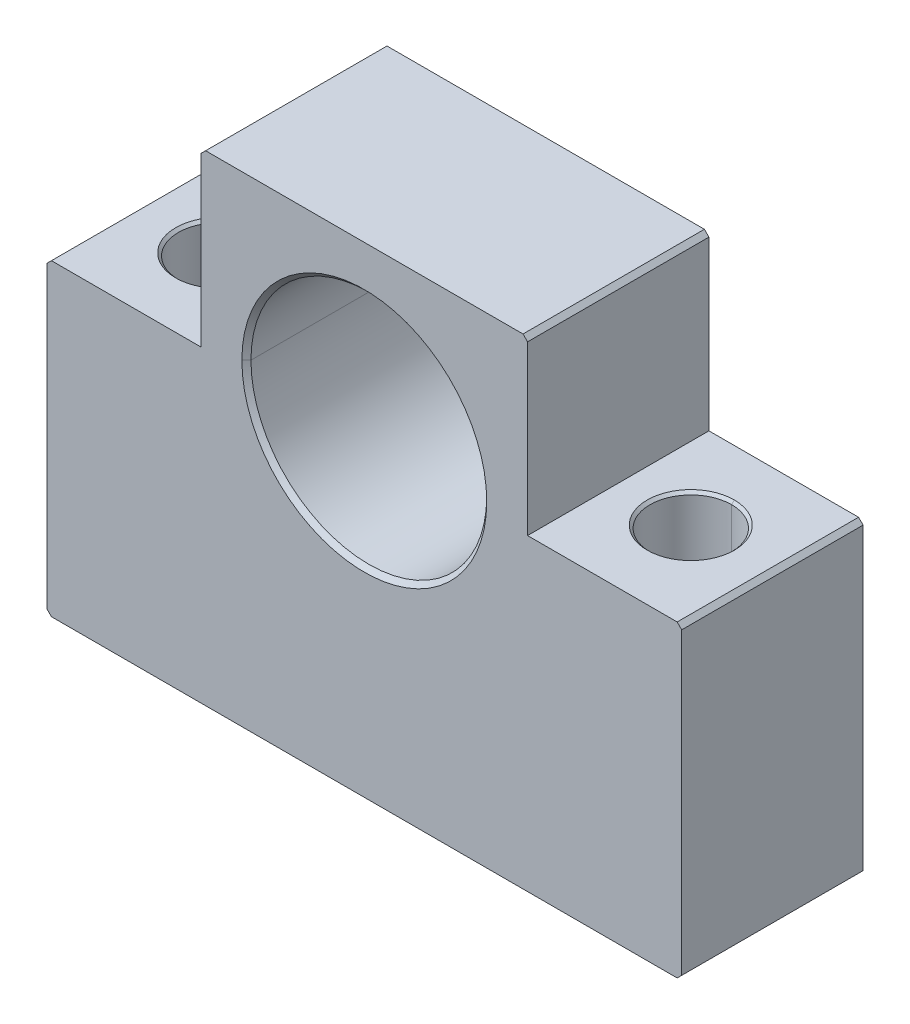
ISO-10303-21;
HEADER;
FILE_DESCRIPTION(('STEP AP214'),'2;1');
FILE_NAME('part.step','',(''),(''),'','','');
FILE_SCHEMA(('AUTOMOTIVE_DESIGN { 1 0 10303 214 1 1 1 1 }'));
ENDSEC;
DATA;
#1=APPLICATION_CONTEXT('core data for automotive mechanical design processes');
#2=APPLICATION_PROTOCOL_DEFINITION('international standard','automotive_design',2000,#1);
#3=PRODUCT_CONTEXT('',#1,'mechanical');
#4=PRODUCT('Part','Part','',(#3));
#5=PRODUCT_RELATED_PRODUCT_CATEGORY('part','',(#4));
#6=PRODUCT_DEFINITION_FORMATION('','',#4);
#7=PRODUCT_DEFINITION_CONTEXT('part definition',#1,'design');
#8=PRODUCT_DEFINITION('design','',#6,#7);
#9=PRODUCT_DEFINITION_SHAPE('','',#8);
#10=(LENGTH_UNIT() NAMED_UNIT(*) SI_UNIT(.MILLI.,.METRE.));
#11=(NAMED_UNIT(*) PLANE_ANGLE_UNIT() SI_UNIT($,.RADIAN.));
#12=(NAMED_UNIT(*) SI_UNIT($,.STERADIAN.) SOLID_ANGLE_UNIT());
#13=UNCERTAINTY_MEASURE_WITH_UNIT(LENGTH_MEASURE(1.E-05),#10,'distance_accuracy_value','');
#14=(GEOMETRIC_REPRESENTATION_CONTEXT(3) GLOBAL_UNCERTAINTY_ASSIGNED_CONTEXT((#13)) GLOBAL_UNIT_ASSIGNED_CONTEXT((#10,
#11,#12)) REPRESENTATION_CONTEXT('',''));
#15=CARTESIAN_POINT('',(0.,0.,0.));
#16=DIRECTION('',(0.,0.,1.));
#17=DIRECTION('',(1.,0.,0.));
#18=AXIS2_PLACEMENT_3D('',#15,#16,#17);
#19=CARTESIAN_POINT('',(-34.5,34.,10.));
#20=DIRECTION('',(0.707106781186548,-0.707106781186548,0.));
#21=DIRECTION('',(0.707106781186548,0.707106781186548,0.));
#22=AXIS2_PLACEMENT_3D('',#19,#20,#21);
#23=PLANE('',#22);
#24=DIRECTION('',(-0.707106781186548,-0.707106781186548,0.));
#25=VECTOR('',#24,1.);
#26=CARTESIAN_POINT('',(-34.5,34.,-10.));
#27=LINE('',#26,#25);
#28=CARTESIAN_POINT('',(-34.5,34.,-10.));
#29=VERTEX_POINT('',#28);
#30=CARTESIAN_POINT('',(-35.,33.5,-10.));
#31=VERTEX_POINT('',#30);
#32=EDGE_CURVE('E11',#29,#31,#27,.T.);
#33=ORIENTED_EDGE('',*,*,#32,.T.);
#34=DIRECTION('',(0.,0.,-1.));
#35=VECTOR('',#34,1.);
#36=CARTESIAN_POINT('',(-35.,33.5,10.));
#37=LINE('',#36,#35);
#38=CARTESIAN_POINT('',(-35.,33.5,10.));
#39=VERTEX_POINT('',#38);
#40=EDGE_CURVE('E25',#39,#31,#37,.T.);
#41=ORIENTED_EDGE('',*,*,#40,.F.);
#42=DIRECTION('',(-0.707106781186548,-0.707106781186548,0.));
#43=VECTOR('',#42,1.);
#44=CARTESIAN_POINT('',(-34.5,34.,10.));
#45=LINE('',#44,#43);
#46=CARTESIAN_POINT('',(-34.5,34.,10.));
#47=VERTEX_POINT('',#46);
#48=EDGE_CURVE('E518',#47,#39,#45,.T.);
#49=ORIENTED_EDGE('',*,*,#48,.F.);
#50=DIRECTION('',(0.,0.,-1.));
#51=VECTOR('',#50,1.);
#52=CARTESIAN_POINT('',(-34.5,34.,10.));
#53=LINE('',#52,#51);
#54=EDGE_CURVE('E514',#47,#29,#53,.T.);
#55=ORIENTED_EDGE('',*,*,#54,.T.);
#56=EDGE_LOOP('',(#33,#41,#49,#55));
#57=FACE_BOUND('',#56,.T.);
#58=ADVANCED_FACE('F17',(#57),#23,.F.);
#59=CARTESIAN_POINT('',(-18.,34.,10.));
#60=DIRECTION('',(0.,-1.,0.));
#61=DIRECTION('',(0.,0.,-1.));
#62=AXIS2_PLACEMENT_3D('',#59,#60,#61);
#63=PLANE('',#62);
#64=CARTESIAN_POINT('',(-26.,34.,0.));
#65=DIRECTION('',(0.,1.,0.));
#66=DIRECTION('',(0.,0.,1.));
#67=AXIS2_PLACEMENT_3D('',#64,#65,#66);
#68=CIRCLE('',#67,4.8);
#69=CARTESIAN_POINT('',(-26.,34.,-4.8));
#70=VERTEX_POINT('',#69);
#71=CARTESIAN_POINT('',(-26.,34.,4.8));
#72=VERTEX_POINT('',#71);
#73=EDGE_CURVE('E509',#70,#72,#68,.T.);
#74=ORIENTED_EDGE('',*,*,#73,.F.);
#75=CARTESIAN_POINT('',(-26.,34.,0.));
#76=DIRECTION('',(0.,1.,0.));
#77=DIRECTION('',(0.,0.,1.));
#78=AXIS2_PLACEMENT_3D('',#75,#76,#77);
#79=CIRCLE('',#78,4.8);
#80=EDGE_CURVE('E504',#72,#70,#79,.T.);
#81=ORIENTED_EDGE('',*,*,#80,.F.);
#82=EDGE_LOOP('',(#74,#81));
#83=FACE_BOUND('',#82,.T.);
#84=DIRECTION('',(-1.,0.,0.));
#85=VECTOR('',#84,1.);
#86=CARTESIAN_POINT('',(-18.,34.,-10.));
#87=LINE('',#86,#85);
#88=CARTESIAN_POINT('',(-18.,34.,-10.));
#89=VERTEX_POINT('',#88);
#90=EDGE_CURVE('E499',#89,#29,#87,.T.);
#91=ORIENTED_EDGE('',*,*,#90,.T.);
#92=ORIENTED_EDGE('',*,*,#54,.F.);
#93=DIRECTION('',(-1.,0.,0.));
#94=VECTOR('',#93,1.);
#95=CARTESIAN_POINT('',(-18.,34.,10.));
#96=LINE('',#95,#94);
#97=CARTESIAN_POINT('',(-18.,34.,10.));
#98=VERTEX_POINT('',#97);
#99=EDGE_CURVE('E494',#98,#47,#96,.T.);
#100=ORIENTED_EDGE('',*,*,#99,.F.);
#101=DIRECTION('',(0.,0.,-1.));
#102=VECTOR('',#101,1.);
#103=CARTESIAN_POINT('',(-18.,34.,10.));
#104=LINE('',#103,#102);
#105=EDGE_CURVE('E490',#98,#89,#104,.T.);
#106=ORIENTED_EDGE('',*,*,#105,.T.);
#107=EDGE_LOOP('',(#91,#92,#100,#106));
#108=FACE_BOUND('',#107,.T.);
#109=ADVANCED_FACE('F536',(#83,#108),#63,.F.);
#110=CARTESIAN_POINT('',(-18.,52.5,10.));
#111=DIRECTION('',(1.,0.,0.));
#112=DIRECTION('',(0.,0.,-1.));
#113=AXIS2_PLACEMENT_3D('',#110,#111,#112);
#114=PLANE('',#113);
#115=DIRECTION('',(0.,-1.,0.));
#116=VECTOR('',#115,1.);
#117=CARTESIAN_POINT('',(-18.,52.5,-10.));
#118=LINE('',#117,#116);
#119=CARTESIAN_POINT('',(-18.,52.5,-10.));
#120=VERTEX_POINT('',#119);
#121=EDGE_CURVE('E485',#120,#89,#118,.T.);
#122=ORIENTED_EDGE('',*,*,#121,.T.);
#123=ORIENTED_EDGE('',*,*,#105,.F.);
#124=DIRECTION('',(0.,-1.,0.));
#125=VECTOR('',#124,1.);
#126=CARTESIAN_POINT('',(-18.,52.5,10.));
#127=LINE('',#126,#125);
#128=CARTESIAN_POINT('',(-18.,52.5,10.));
#129=VERTEX_POINT('',#128);
#130=EDGE_CURVE('E480',#129,#98,#127,.T.);
#131=ORIENTED_EDGE('',*,*,#130,.F.);
#132=DIRECTION('',(0.,0.,-1.));
#133=VECTOR('',#132,1.);
#134=CARTESIAN_POINT('',(-18.,52.5,10.));
#135=LINE('',#134,#133);
#136=EDGE_CURVE('E476',#129,#120,#135,.T.);
#137=ORIENTED_EDGE('',*,*,#136,.T.);
#138=EDGE_LOOP('',(#122,#123,#131,#137));
#139=FACE_BOUND('',#138,.T.);
#140=ADVANCED_FACE('F581',(#139),#114,.F.);
#141=CARTESIAN_POINT('',(-17.5,53.,10.));
#142=DIRECTION('',(0.707106781186548,-0.707106781186548,0.));
#143=DIRECTION('',(0.707106781186548,0.707106781186548,0.));
#144=AXIS2_PLACEMENT_3D('',#141,#142,#143);
#145=PLANE('',#144);
#146=DIRECTION('',(-0.707106781186548,-0.707106781186548,0.));
#147=VECTOR('',#146,1.);
#148=CARTESIAN_POINT('',(-17.5,53.,-10.));
#149=LINE('',#148,#147);
#150=CARTESIAN_POINT('',(-17.5,53.,-10.));
#151=VERTEX_POINT('',#150);
#152=EDGE_CURVE('E471',#151,#120,#149,.T.);
#153=ORIENTED_EDGE('',*,*,#152,.T.);
#154=ORIENTED_EDGE('',*,*,#136,.F.);
#155=DIRECTION('',(-0.707106781186548,-0.707106781186548,0.));
#156=VECTOR('',#155,1.);
#157=CARTESIAN_POINT('',(-17.5,53.,10.));
#158=LINE('',#157,#156);
#159=CARTESIAN_POINT('',(-17.5,53.,10.));
#160=VERTEX_POINT('',#159);
#161=EDGE_CURVE('E466',#160,#129,#158,.T.);
#162=ORIENTED_EDGE('',*,*,#161,.F.);
#163=DIRECTION('',(0.,0.,-1.));
#164=VECTOR('',#163,1.);
#165=CARTESIAN_POINT('',(-17.5,53.,10.));
#166=LINE('',#165,#164);
#167=EDGE_CURVE('E462',#160,#151,#166,.T.);
#168=ORIENTED_EDGE('',*,*,#167,.T.);
#169=EDGE_LOOP('',(#153,#154,#162,#168));
#170=FACE_BOUND('',#169,.T.);
#171=ADVANCED_FACE('F578',(#170),#145,.F.);
#172=CARTESIAN_POINT('',(17.5,53.,10.));
#173=DIRECTION('',(0.,-1.,0.));
#174=DIRECTION('',(0.,0.,-1.));
#175=AXIS2_PLACEMENT_3D('',#172,#173,#174);
#176=PLANE('',#175);
#177=DIRECTION('',(-1.,0.,0.));
#178=VECTOR('',#177,1.);
#179=CARTESIAN_POINT('',(17.5,53.,-10.));
#180=LINE('',#179,#178);
#181=CARTESIAN_POINT('',(17.5,53.,-10.));
#182=VERTEX_POINT('',#181);
#183=EDGE_CURVE('E457',#182,#151,#180,.T.);
#184=ORIENTED_EDGE('',*,*,#183,.T.);
#185=ORIENTED_EDGE('',*,*,#167,.F.);
#186=DIRECTION('',(-1.,0.,0.));
#187=VECTOR('',#186,1.);
#188=CARTESIAN_POINT('',(17.5,53.,10.));
#189=LINE('',#188,#187);
#190=CARTESIAN_POINT('',(17.5,53.,10.));
#191=VERTEX_POINT('',#190);
#192=EDGE_CURVE('E452',#191,#160,#189,.T.);
#193=ORIENTED_EDGE('',*,*,#192,.F.);
#194=DIRECTION('',(0.,0.,-1.));
#195=VECTOR('',#194,1.);
#196=CARTESIAN_POINT('',(17.5,53.,10.));
#197=LINE('',#196,#195);
#198=EDGE_CURVE('E448',#191,#182,#197,.T.);
#199=ORIENTED_EDGE('',*,*,#198,.T.);
#200=EDGE_LOOP('',(#184,#185,#193,#199));
#201=FACE_BOUND('',#200,.T.);
#202=ADVANCED_FACE('F575',(#201),#176,.F.);
#203=CARTESIAN_POINT('',(18.,52.5,10.));
#204=DIRECTION('',(-0.707106781186548,-0.707106781186548,0.));
#205=DIRECTION('',(0.707106781186548,-0.707106781186548,0.));
#206=AXIS2_PLACEMENT_3D('',#203,#204,#205);
#207=PLANE('',#206);
#208=DIRECTION('',(-0.707106781186548,0.707106781186548,0.));
#209=VECTOR('',#208,1.);
#210=CARTESIAN_POINT('',(18.,52.5,-10.));
#211=LINE('',#210,#209);
#212=CARTESIAN_POINT('',(18.,52.5,-10.));
#213=VERTEX_POINT('',#212);
#214=EDGE_CURVE('E443',#213,#182,#211,.T.);
#215=ORIENTED_EDGE('',*,*,#214,.T.);
#216=ORIENTED_EDGE('',*,*,#198,.F.);
#217=DIRECTION('',(-0.707106781186548,0.707106781186548,0.));
#218=VECTOR('',#217,1.);
#219=CARTESIAN_POINT('',(18.,52.5,10.));
#220=LINE('',#219,#218);
#221=CARTESIAN_POINT('',(18.,52.5,10.));
#222=VERTEX_POINT('',#221);
#223=EDGE_CURVE('E438',#222,#191,#220,.T.);
#224=ORIENTED_EDGE('',*,*,#223,.F.);
#225=DIRECTION('',(0.,0.,-1.));
#226=VECTOR('',#225,1.);
#227=CARTESIAN_POINT('',(18.,52.5,10.));
#228=LINE('',#227,#226);
#229=EDGE_CURVE('E434',#222,#213,#228,.T.);
#230=ORIENTED_EDGE('',*,*,#229,.T.);
#231=EDGE_LOOP('',(#215,#216,#224,#230));
#232=FACE_BOUND('',#231,.T.);
#233=ADVANCED_FACE('F572',(#232),#207,.F.);
#234=CARTESIAN_POINT('',(18.,34.,10.));
#235=DIRECTION('',(-1.,0.,0.));
#236=DIRECTION('',(0.,0.,1.));
#237=AXIS2_PLACEMENT_3D('',#234,#235,#236);
#238=PLANE('',#237);
#239=DIRECTION('',(0.,1.,0.));
#240=VECTOR('',#239,1.);
#241=CARTESIAN_POINT('',(18.,34.,-10.));
#242=LINE('',#241,#240);
#243=CARTESIAN_POINT('',(18.,34.,-10.));
#244=VERTEX_POINT('',#243);
#245=EDGE_CURVE('E429',#244,#213,#242,.T.);
#246=ORIENTED_EDGE('',*,*,#245,.T.);
#247=ORIENTED_EDGE('',*,*,#229,.F.);
#248=DIRECTION('',(0.,1.,0.));
#249=VECTOR('',#248,1.);
#250=CARTESIAN_POINT('',(18.,34.,10.));
#251=LINE('',#250,#249);
#252=CARTESIAN_POINT('',(18.,34.,10.));
#253=VERTEX_POINT('',#252);
#254=EDGE_CURVE('E424',#253,#222,#251,.T.);
#255=ORIENTED_EDGE('',*,*,#254,.F.);
#256=DIRECTION('',(0.,0.,-1.));
#257=VECTOR('',#256,1.);
#258=CARTESIAN_POINT('',(18.,34.,10.));
#259=LINE('',#258,#257);
#260=EDGE_CURVE('E420',#253,#244,#259,.T.);
#261=ORIENTED_EDGE('',*,*,#260,.T.);
#262=EDGE_LOOP('',(#246,#247,#255,#261));
#263=FACE_BOUND('',#262,.T.);
#264=ADVANCED_FACE('F566',(#263),#238,.F.);
#265=CARTESIAN_POINT('',(34.5,34.,10.));
#266=DIRECTION('',(0.,-1.,0.));
#267=DIRECTION('',(0.,0.,-1.));
#268=AXIS2_PLACEMENT_3D('',#265,#266,#267);
#269=PLANE('',#268);
#270=CARTESIAN_POINT('',(26.,34.,0.));
#271=DIRECTION('',(0.,1.,0.));
#272=DIRECTION('',(0.,0.,1.));
#273=AXIS2_PLACEMENT_3D('',#270,#271,#272);
#274=CIRCLE('',#273,4.8);
#275=CARTESIAN_POINT('',(26.,34.,-4.8));
#276=VERTEX_POINT('',#275);
#277=CARTESIAN_POINT('',(26.,34.,4.8));
#278=VERTEX_POINT('',#277);
#279=EDGE_CURVE('E191',#276,#278,#274,.T.);
#280=ORIENTED_EDGE('',*,*,#279,.F.);
#281=CARTESIAN_POINT('',(26.,34.,0.));
#282=DIRECTION('',(0.,1.,0.));
#283=DIRECTION('',(0.,0.,1.));
#284=AXIS2_PLACEMENT_3D('',#281,#282,#283);
#285=CIRCLE('',#284,4.8);
#286=EDGE_CURVE('E413',#278,#276,#285,.T.);
#287=ORIENTED_EDGE('',*,*,#286,.F.);
#288=EDGE_LOOP('',(#280,#287));
#289=FACE_BOUND('',#288,.T.);
#290=DIRECTION('',(-1.,0.,0.));
#291=VECTOR('',#290,1.);
#292=CARTESIAN_POINT('',(34.5,34.,-10.));
#293=LINE('',#292,#291);
#294=CARTESIAN_POINT('',(34.5,34.,-10.));
#295=VERTEX_POINT('',#294);
#296=EDGE_CURVE('E408',#295,#244,#293,.T.);
#297=ORIENTED_EDGE('',*,*,#296,.T.);
#298=ORIENTED_EDGE('',*,*,#260,.F.);
#299=DIRECTION('',(-1.,0.,0.));
#300=VECTOR('',#299,1.);
#301=CARTESIAN_POINT('',(34.5,34.,10.));
#302=LINE('',#301,#300);
#303=CARTESIAN_POINT('',(34.5,34.,10.));
#304=VERTEX_POINT('',#303);
#305=EDGE_CURVE('E403',#304,#253,#302,.T.);
#306=ORIENTED_EDGE('',*,*,#305,.F.);
#307=DIRECTION('',(0.,0.,-1.));
#308=VECTOR('',#307,1.);
#309=CARTESIAN_POINT('',(34.5,34.,10.));
#310=LINE('',#309,#308);
#311=EDGE_CURVE('E399',#304,#295,#310,.T.);
#312=ORIENTED_EDGE('',*,*,#311,.T.);
#313=EDGE_LOOP('',(#297,#298,#306,#312));
#314=FACE_BOUND('',#313,.T.);
#315=ADVANCED_FACE('F562',(#289,#314),#269,.F.);
#316=CARTESIAN_POINT('',(35.,33.5,10.));
#317=DIRECTION('',(-0.707106781186548,-0.707106781186548,0.));
#318=DIRECTION('',(0.707106781186548,-0.707106781186548,0.));
#319=AXIS2_PLACEMENT_3D('',#316,#317,#318);
#320=PLANE('',#319);
#321=DIRECTION('',(-0.707106781186548,0.707106781186548,0.));
#322=VECTOR('',#321,1.);
#323=CARTESIAN_POINT('',(35.,33.5,-10.));
#324=LINE('',#323,#322);
#325=CARTESIAN_POINT('',(35.,33.5,-10.));
#326=VERTEX_POINT('',#325);
#327=EDGE_CURVE('E394',#326,#295,#324,.T.);
#328=ORIENTED_EDGE('',*,*,#327,.T.);
#329=ORIENTED_EDGE('',*,*,#311,.F.);
#330=DIRECTION('',(-0.707106781186548,0.707106781186548,0.));
#331=VECTOR('',#330,1.);
#332=CARTESIAN_POINT('',(35.,33.5,10.));
#333=LINE('',#332,#331);
#334=CARTESIAN_POINT('',(35.,33.5,10.));
#335=VERTEX_POINT('',#334);
#336=EDGE_CURVE('E389',#335,#304,#333,.T.);
#337=ORIENTED_EDGE('',*,*,#336,.F.);
#338=DIRECTION('',(0.,0.,-1.));
#339=VECTOR('',#338,1.);
#340=CARTESIAN_POINT('',(35.,33.5,10.));
#341=LINE('',#340,#339);
#342=EDGE_CURVE('E385',#335,#326,#341,.T.);
#343=ORIENTED_EDGE('',*,*,#342,.T.);
#344=EDGE_LOOP('',(#328,#329,#337,#343));
#345=FACE_BOUND('',#344,.T.);
#346=ADVANCED_FACE('F559',(#345),#320,.F.);
#347=CARTESIAN_POINT('',(35.,0.5,10.));
#348=DIRECTION('',(-1.,0.,0.));
#349=DIRECTION('',(0.,0.,1.));
#350=AXIS2_PLACEMENT_3D('',#347,#348,#349);
#351=PLANE('',#350);
#352=DIRECTION('',(0.,1.,0.));
#353=VECTOR('',#352,1.);
#354=CARTESIAN_POINT('',(35.,0.5,-10.));
#355=LINE('',#354,#353);
#356=CARTESIAN_POINT('',(35.,0.5,-10.));
#357=VERTEX_POINT('',#356);
#358=EDGE_CURVE('E380',#357,#326,#355,.T.);
#359=ORIENTED_EDGE('',*,*,#358,.T.);
#360=ORIENTED_EDGE('',*,*,#342,.F.);
#361=DIRECTION('',(0.,1.,0.));
#362=VECTOR('',#361,1.);
#363=CARTESIAN_POINT('',(35.,0.5,10.));
#364=LINE('',#363,#362);
#365=CARTESIAN_POINT('',(35.,0.5,10.));
#366=VERTEX_POINT('',#365);
#367=EDGE_CURVE('E375',#366,#335,#364,.T.);
#368=ORIENTED_EDGE('',*,*,#367,.F.);
#369=DIRECTION('',(0.,0.,-1.));
#370=VECTOR('',#369,1.);
#371=CARTESIAN_POINT('',(35.,0.5,10.));
#372=LINE('',#371,#370);
#373=EDGE_CURVE('E371',#366,#357,#372,.T.);
#374=ORIENTED_EDGE('',*,*,#373,.T.);
#375=EDGE_LOOP('',(#359,#360,#368,#374));
#376=FACE_BOUND('',#375,.T.);
#377=ADVANCED_FACE('F554',(#376),#351,.F.);
#378=CARTESIAN_POINT('',(34.5,0.,10.));
#379=DIRECTION('',(-0.707106781186547,0.707106781186548,0.));
#380=DIRECTION('',(-0.707106781186548,-0.707106781186547,0.));
#381=AXIS2_PLACEMENT_3D('',#378,#379,#380);
#382=PLANE('',#381);
#383=DIRECTION('',(0.707106781186548,0.707106781186547,0.));
#384=VECTOR('',#383,1.);
#385=CARTESIAN_POINT('',(34.5,0.,-10.));
#386=LINE('',#385,#384);
#387=CARTESIAN_POINT('',(34.5,0.,-10.));
#388=VERTEX_POINT('',#387);
#389=EDGE_CURVE('E366',#388,#357,#386,.T.);
#390=ORIENTED_EDGE('',*,*,#389,.T.);
#391=ORIENTED_EDGE('',*,*,#373,.F.);
#392=DIRECTION('',(0.707106781186548,0.707106781186547,0.));
#393=VECTOR('',#392,1.);
#394=CARTESIAN_POINT('',(34.5,0.,10.));
#395=LINE('',#394,#393);
#396=CARTESIAN_POINT('',(34.5,0.,10.));
#397=VERTEX_POINT('',#396);
#398=EDGE_CURVE('E361',#397,#366,#395,.T.);
#399=ORIENTED_EDGE('',*,*,#398,.F.);
#400=DIRECTION('',(0.,0.,-1.));
#401=VECTOR('',#400,1.);
#402=CARTESIAN_POINT('',(34.5,0.,10.));
#403=LINE('',#402,#401);
#404=EDGE_CURVE('E357',#397,#388,#403,.T.);
#405=ORIENTED_EDGE('',*,*,#404,.T.);
#406=EDGE_LOOP('',(#390,#391,#399,#405));
#407=FACE_BOUND('',#406,.T.);
#408=ADVANCED_FACE('F551',(#407),#382,.F.);
#409=CARTESIAN_POINT('',(-34.5,0.,10.));
#410=DIRECTION('',(0.,1.,0.));
#411=DIRECTION('',(0.,0.,1.));
#412=AXIS2_PLACEMENT_3D('',#409,#410,#411);
#413=PLANE('',#412);
#414=CARTESIAN_POINT('',(26.,0.,0.));
#415=DIRECTION('',(0.,1.,0.));
#416=DIRECTION('',(0.,0.,1.));
#417=AXIS2_PLACEMENT_3D('',#414,#415,#416);
#418=CIRCLE('',#417,4.5);
#419=CARTESIAN_POINT('',(26.,0.,4.5));
#420=VERTEX_POINT('',#419);
#421=CARTESIAN_POINT('',(26.,0.,-4.5));
#422=VERTEX_POINT('',#421);
#423=EDGE_CURVE('E203',#420,#422,#418,.T.);
#424=ORIENTED_EDGE('',*,*,#423,.T.);
#425=CARTESIAN_POINT('',(26.,0.,0.));
#426=DIRECTION('',(0.,1.,0.));
#427=DIRECTION('',(0.,0.,1.));
#428=AXIS2_PLACEMENT_3D('',#425,#426,#427);
#429=CIRCLE('',#428,4.5);
#430=EDGE_CURVE('E350',#422,#420,#429,.T.);
#431=ORIENTED_EDGE('',*,*,#430,.T.);
#432=EDGE_LOOP('',(#424,#431));
#433=FACE_BOUND('',#432,.T.);
#434=CARTESIAN_POINT('',(-26.,0.,0.));
#435=DIRECTION('',(0.,1.,0.));
#436=DIRECTION('',(0.,0.,1.));
#437=AXIS2_PLACEMENT_3D('',#434,#435,#436);
#438=CIRCLE('',#437,4.5);
#439=CARTESIAN_POINT('',(-26.,0.,4.5));
#440=VERTEX_POINT('',#439);
#441=CARTESIAN_POINT('',(-26.,0.,-4.5));
#442=VERTEX_POINT('',#441);
#443=EDGE_CURVE('E346',#440,#442,#438,.T.);
#444=ORIENTED_EDGE('',*,*,#443,.T.);
#445=CARTESIAN_POINT('',(-26.,0.,0.));
#446=DIRECTION('',(0.,1.,0.));
#447=DIRECTION('',(0.,0.,1.));
#448=AXIS2_PLACEMENT_3D('',#445,#446,#447);
#449=CIRCLE('',#448,4.5);
#450=EDGE_CURVE('E342',#442,#440,#449,.T.);
#451=ORIENTED_EDGE('',*,*,#450,.T.);
#452=EDGE_LOOP('',(#444,#451));
#453=FACE_BOUND('',#452,.T.);
#454=DIRECTION('',(1.,0.,0.));
#455=VECTOR('',#454,1.);
#456=CARTESIAN_POINT('',(-34.5,0.,-10.));
#457=LINE('',#456,#455);
#458=CARTESIAN_POINT('',(-34.5,0.,-10.));
#459=VERTEX_POINT('',#458);
#460=EDGE_CURVE('E337',#459,#388,#457,.T.);
#461=ORIENTED_EDGE('',*,*,#460,.T.);
#462=ORIENTED_EDGE('',*,*,#404,.F.);
#463=DIRECTION('',(1.,0.,0.));
#464=VECTOR('',#463,1.);
#465=CARTESIAN_POINT('',(-34.5,0.,10.));
#466=LINE('',#465,#464);
#467=CARTESIAN_POINT('',(-34.5,0.,10.));
#468=VERTEX_POINT('',#467);
#469=EDGE_CURVE('E332',#468,#397,#466,.T.);
#470=ORIENTED_EDGE('',*,*,#469,.F.);
#471=DIRECTION('',(0.,0.,-1.));
#472=VECTOR('',#471,1.);
#473=CARTESIAN_POINT('',(-34.5,0.,10.));
#474=LINE('',#473,#472);
#475=EDGE_CURVE('E328',#468,#459,#474,.T.);
#476=ORIENTED_EDGE('',*,*,#475,.T.);
#477=EDGE_LOOP('',(#461,#462,#470,#476));
#478=FACE_BOUND('',#477,.T.);
#479=ADVANCED_FACE('F549',(#433,#453,#478),#413,.F.);
#480=CARTESIAN_POINT('',(-35.,0.5,10.));
#481=DIRECTION('',(0.707106781186547,0.707106781186548,0.));
#482=DIRECTION('',(-0.707106781186548,0.707106781186547,0.));
#483=AXIS2_PLACEMENT_3D('',#480,#481,#482);
#484=PLANE('',#483);
#485=DIRECTION('',(0.707106781186548,-0.707106781186547,0.));
#486=VECTOR('',#485,1.);
#487=CARTESIAN_POINT('',(-35.,0.5,-10.));
#488=LINE('',#487,#486);
#489=CARTESIAN_POINT('',(-35.,0.5,-10.));
#490=VERTEX_POINT('',#489);
#491=EDGE_CURVE('E323',#490,#459,#488,.T.);
#492=ORIENTED_EDGE('',*,*,#491,.T.);
#493=ORIENTED_EDGE('',*,*,#475,.F.);
#494=DIRECTION('',(0.707106781186548,-0.707106781186547,0.));
#495=VECTOR('',#494,1.);
#496=CARTESIAN_POINT('',(-35.,0.5,10.));
#497=LINE('',#496,#495);
#498=CARTESIAN_POINT('',(-35.,0.5,10.));
#499=VERTEX_POINT('',#498);
#500=EDGE_CURVE('E318',#499,#468,#497,.T.);
#501=ORIENTED_EDGE('',*,*,#500,.F.);
#502=DIRECTION('',(0.,0.,-1.));
#503=VECTOR('',#502,1.);
#504=CARTESIAN_POINT('',(-35.,0.5,10.));
#505=LINE('',#504,#503);
#506=EDGE_CURVE('E314',#499,#490,#505,.T.);
#507=ORIENTED_EDGE('',*,*,#506,.T.);
#508=EDGE_LOOP('',(#492,#493,#501,#507));
#509=FACE_BOUND('',#508,.T.);
#510=ADVANCED_FACE('F545',(#509),#484,.F.);
#511=CARTESIAN_POINT('',(-35.,33.5,10.));
#512=DIRECTION('',(1.,0.,0.));
#513=DIRECTION('',(0.,0.,-1.));
#514=AXIS2_PLACEMENT_3D('',#511,#512,#513);
#515=PLANE('',#514);
#516=DIRECTION('',(0.,-1.,0.));
#517=VECTOR('',#516,1.);
#518=CARTESIAN_POINT('',(-35.,33.5,-10.));
#519=LINE('',#518,#517);
#520=EDGE_CURVE('E309',#31,#490,#519,.T.);
#521=ORIENTED_EDGE('',*,*,#520,.T.);
#522=ORIENTED_EDGE('',*,*,#506,.F.);
#523=DIRECTION('',(0.,-1.,0.));
#524=VECTOR('',#523,1.);
#525=CARTESIAN_POINT('',(-35.,33.5,10.));
#526=LINE('',#525,#524);
#527=EDGE_CURVE('E304',#39,#499,#526,.T.);
#528=ORIENTED_EDGE('',*,*,#527,.F.);
#529=ORIENTED_EDGE('',*,*,#40,.T.);
#530=EDGE_LOOP('',(#521,#522,#528,#529));
#531=FACE_BOUND('',#530,.T.);
#532=ADVANCED_FACE('F528',(#531),#515,.F.);
#533=CARTESIAN_POINT('',(0.,0.,10.));
#534=DIRECTION('',(0.,0.,1.));
#535=DIRECTION('',(1.,0.,0.));
#536=AXIS2_PLACEMENT_3D('',#533,#534,#535);
#537=PLANE('',#536);
#538=CARTESIAN_POINT('',(0.,35.,10.));
#539=DIRECTION('',(0.,0.,-1.));
#540=DIRECTION('',(-1.,0.,0.));
#541=AXIS2_PLACEMENT_3D('',#538,#539,#540);
#542=CIRCLE('',#541,13.5);
#543=CARTESIAN_POINT('',(-13.5,35.,10.));
#544=VERTEX_POINT('',#543);
#545=CARTESIAN_POINT('',(13.5,35.,10.));
#546=VERTEX_POINT('',#545);
#547=EDGE_CURVE('E300',#544,#546,#542,.T.);
#548=ORIENTED_EDGE('',*,*,#547,.T.);
#549=CARTESIAN_POINT('',(0.,35.,10.));
#550=DIRECTION('',(0.,0.,-1.));
#551=DIRECTION('',(-1.,0.,0.));
#552=AXIS2_PLACEMENT_3D('',#549,#550,#551);
#553=CIRCLE('',#552,13.5);
#554=EDGE_CURVE('E296',#546,#544,#553,.T.);
#555=ORIENTED_EDGE('',*,*,#554,.T.);
#556=EDGE_LOOP('',(#548,#555));
#557=FACE_BOUND('',#556,.T.);
#558=ORIENTED_EDGE('',*,*,#48,.T.);
#559=ORIENTED_EDGE('',*,*,#527,.T.);
#560=ORIENTED_EDGE('',*,*,#500,.T.);
#561=ORIENTED_EDGE('',*,*,#469,.T.);
#562=ORIENTED_EDGE('',*,*,#398,.T.);
#563=ORIENTED_EDGE('',*,*,#367,.T.);
#564=ORIENTED_EDGE('',*,*,#336,.T.);
#565=ORIENTED_EDGE('',*,*,#305,.T.);
#566=ORIENTED_EDGE('',*,*,#254,.T.);
#567=ORIENTED_EDGE('',*,*,#223,.T.);
#568=ORIENTED_EDGE('',*,*,#192,.T.);
#569=ORIENTED_EDGE('',*,*,#161,.T.);
#570=ORIENTED_EDGE('',*,*,#130,.T.);
#571=ORIENTED_EDGE('',*,*,#99,.T.);
#572=EDGE_LOOP('',(#558,#559,#560,#561,#562,#563,#564,#565,#566,#567,#568,#569,#570,#571));
#573=FACE_BOUND('',#572,.T.);
#574=ADVANCED_FACE('F532',(#557,#573),#537,.T.);
#575=CARTESIAN_POINT('',(0.,35.,10.));
#576=DIRECTION('',(0.,0.,1.));
#577=DIRECTION('',(0.,1.,0.));
#578=AXIS2_PLACEMENT_3D('',#575,#576,#577);
#579=CONICAL_SURFACE('',#578,13.5,0.785398163397448);
#580=DIRECTION('',(-0.707106781186548,0.,0.707106781186548));
#581=VECTOR('',#580,1.);
#582=CARTESIAN_POINT('',(-13.,35.,9.5));
#583=LINE('',#582,#581);
#584=CARTESIAN_POINT('',(-13.,35.,9.5));
#585=VERTEX_POINT('',#584);
#586=EDGE_CURVE('E291',#585,#544,#583,.T.);
#587=ORIENTED_EDGE('',*,*,#586,.T.);
#588=ORIENTED_EDGE('',*,*,#554,.F.);
#589=DIRECTION('',(0.707106781186548,0.,0.707106781186548));
#590=VECTOR('',#589,1.);
#591=CARTESIAN_POINT('',(13.,35.,9.5));
#592=LINE('',#591,#590);
#593=CARTESIAN_POINT('',(13.,35.,9.5));
#594=VERTEX_POINT('',#593);
#595=EDGE_CURVE('E286',#594,#546,#592,.T.);
#596=ORIENTED_EDGE('',*,*,#595,.F.);
#597=CARTESIAN_POINT('',(0.,35.,9.5));
#598=DIRECTION('',(0.,0.,-1.));
#599=DIRECTION('',(-1.,0.,0.));
#600=AXIS2_PLACEMENT_3D('',#597,#598,#599);
#601=CIRCLE('',#600,13.);
#602=EDGE_CURVE('E282',#594,#585,#601,.T.);
#603=ORIENTED_EDGE('',*,*,#602,.T.);
#604=EDGE_LOOP('',(#587,#588,#596,#603));
#605=FACE_BOUND('',#604,.T.);
#606=ADVANCED_FACE('F717',(#605),#579,.F.);
#607=CARTESIAN_POINT('',(0.,35.,-10.));
#608=DIRECTION('',(0.,0.,-1.));
#609=DIRECTION('',(0.,1.,0.));
#610=AXIS2_PLACEMENT_3D('',#607,#608,#609);
#611=CYLINDRICAL_SURFACE('',#610,13.);
#612=DIRECTION('',(0.,0.,-1.));
#613=VECTOR('',#612,1.);
#614=CARTESIAN_POINT('',(13.,35.,9.5));
#615=LINE('',#614,#613);
#616=CARTESIAN_POINT('',(13.,35.,-9.5));
#617=VERTEX_POINT('',#616);
#618=EDGE_CURVE('E278',#594,#617,#615,.T.);
#619=ORIENTED_EDGE('',*,*,#618,.T.);
#620=CARTESIAN_POINT('',(0.,35.,-9.5));
#621=DIRECTION('',(0.,0.,-1.));
#622=DIRECTION('',(-1.,0.,0.));
#623=AXIS2_PLACEMENT_3D('',#620,#621,#622);
#624=CIRCLE('',#623,13.);
#625=CARTESIAN_POINT('',(-13.,35.,-9.5));
#626=VERTEX_POINT('',#625);
#627=EDGE_CURVE('E274',#617,#626,#624,.T.);
#628=ORIENTED_EDGE('',*,*,#627,.T.);
#629=DIRECTION('',(0.,0.,-1.));
#630=VECTOR('',#629,1.);
#631=CARTESIAN_POINT('',(-13.,35.,9.5));
#632=LINE('',#631,#630);
#633=EDGE_CURVE('E269',#585,#626,#632,.T.);
#634=ORIENTED_EDGE('',*,*,#633,.F.);
#635=ORIENTED_EDGE('',*,*,#602,.F.);
#636=EDGE_LOOP('',(#619,#628,#634,#635));
#637=FACE_BOUND('',#636,.T.);
#638=ADVANCED_FACE('F728',(#637),#611,.F.);
#639=CARTESIAN_POINT('',(0.,35.,-10.));
#640=DIRECTION('',(0.,0.,-1.));
#641=DIRECTION('',(-2.35706471361916E-12,-1.,0.));
#642=AXIS2_PLACEMENT_3D('',#639,#640,#641);
#643=CYLINDRICAL_SURFACE('',#642,13.);
#644=ORIENTED_EDGE('',*,*,#618,.F.);
#645=CARTESIAN_POINT('',(0.,35.,9.5));
#646=DIRECTION('',(0.,0.,-1.));
#647=DIRECTION('',(-1.,0.,0.));
#648=AXIS2_PLACEMENT_3D('',#645,#646,#647);
#649=CIRCLE('',#648,13.);
#650=EDGE_CURVE('E264',#585,#594,#649,.T.);
#651=ORIENTED_EDGE('',*,*,#650,.F.);
#652=ORIENTED_EDGE('',*,*,#633,.T.);
#653=CARTESIAN_POINT('',(0.,35.,-9.5));
#654=DIRECTION('',(0.,0.,-1.));
#655=DIRECTION('',(-1.,0.,0.));
#656=AXIS2_PLACEMENT_3D('',#653,#654,#655);
#657=CIRCLE('',#656,13.);
#658=EDGE_CURVE('E259',#626,#617,#657,.T.);
#659=ORIENTED_EDGE('',*,*,#658,.T.);
#660=EDGE_LOOP('',(#644,#651,#652,#659));
#661=FACE_BOUND('',#660,.T.);
#662=ADVANCED_FACE('F739',(#661),#643,.F.);
#663=CARTESIAN_POINT('',(0.,35.,-9.5));
#664=DIRECTION('',(0.,0.,-1.));
#665=DIRECTION('',(0.,-1.,0.));
#666=AXIS2_PLACEMENT_3D('',#663,#664,#665);
#667=CONICAL_SURFACE('',#666,13.,0.785398163397448);
#668=DIRECTION('',(0.707106781186548,0.,-0.707106781186548));
#669=VECTOR('',#668,1.);
#670=CARTESIAN_POINT('',(13.,35.,-9.5));
#671=LINE('',#670,#669);
#672=CARTESIAN_POINT('',(13.5,35.,-10.));
#673=VERTEX_POINT('',#672);
#674=EDGE_CURVE('E254',#617,#673,#671,.T.);
#675=ORIENTED_EDGE('',*,*,#674,.F.);
#676=ORIENTED_EDGE('',*,*,#658,.F.);
#677=DIRECTION('',(-0.707106781186548,0.,-0.707106781186548));
#678=VECTOR('',#677,1.);
#679=CARTESIAN_POINT('',(-13.,35.,-9.5));
#680=LINE('',#679,#678);
#681=CARTESIAN_POINT('',(-13.5,35.,-10.));
#682=VERTEX_POINT('',#681);
#683=EDGE_CURVE('E250',#626,#682,#680,.T.);
#684=ORIENTED_EDGE('',*,*,#683,.T.);
#685=CARTESIAN_POINT('',(0.,35.,-10.));
#686=DIRECTION('',(0.,0.,-1.));
#687=DIRECTION('',(-1.,0.,0.));
#688=AXIS2_PLACEMENT_3D('',#685,#686,#687);
#689=CIRCLE('',#688,13.5);
#690=EDGE_CURVE('E246',#682,#673,#689,.T.);
#691=ORIENTED_EDGE('',*,*,#690,.T.);
#692=EDGE_LOOP('',(#675,#676,#684,#691));
#693=FACE_BOUND('',#692,.T.);
#694=ADVANCED_FACE('F750',(#693),#667,.F.);
#695=CARTESIAN_POINT('',(0.,0.,-10.));
#696=DIRECTION('',(0.,0.,1.));
#697=DIRECTION('',(1.,0.,0.));
#698=AXIS2_PLACEMENT_3D('',#695,#696,#697);
#699=PLANE('',#698);
#700=CARTESIAN_POINT('',(0.,35.,-10.));
#701=DIRECTION('',(0.,0.,-1.));
#702=DIRECTION('',(-1.,0.,0.));
#703=AXIS2_PLACEMENT_3D('',#700,#701,#702);
#704=CIRCLE('',#703,13.5);
#705=EDGE_CURVE('E241',#673,#682,#704,.T.);
#706=ORIENTED_EDGE('',*,*,#705,.F.);
#707=ORIENTED_EDGE('',*,*,#690,.F.);
#708=EDGE_LOOP('',(#706,#707));
#709=FACE_BOUND('',#708,.T.);
#710=ORIENTED_EDGE('',*,*,#32,.F.);
#711=ORIENTED_EDGE('',*,*,#90,.F.);
#712=ORIENTED_EDGE('',*,*,#121,.F.);
#713=ORIENTED_EDGE('',*,*,#152,.F.);
#714=ORIENTED_EDGE('',*,*,#183,.F.);
#715=ORIENTED_EDGE('',*,*,#214,.F.);
#716=ORIENTED_EDGE('',*,*,#245,.F.);
#717=ORIENTED_EDGE('',*,*,#296,.F.);
#718=ORIENTED_EDGE('',*,*,#327,.F.);
#719=ORIENTED_EDGE('',*,*,#358,.F.);
#720=ORIENTED_EDGE('',*,*,#389,.F.);
#721=ORIENTED_EDGE('',*,*,#460,.F.);
#722=ORIENTED_EDGE('',*,*,#491,.F.);
#723=ORIENTED_EDGE('',*,*,#520,.F.);
#724=EDGE_LOOP('',(#710,#711,#712,#713,#714,#715,#716,#717,#718,#719,#720,#721,#722,#723));
#725=FACE_BOUND('',#724,.T.);
#726=ADVANCED_FACE('F540',(#709,#725),#699,.F.);
#727=CARTESIAN_POINT('',(0.,35.,-9.5));
#728=DIRECTION('',(0.,0.,-1.));
#729=DIRECTION('',(0.,1.,0.));
#730=AXIS2_PLACEMENT_3D('',#727,#728,#729);
#731=CONICAL_SURFACE('',#730,13.,0.785398163397448);
#732=ORIENTED_EDGE('',*,*,#674,.T.);
#733=ORIENTED_EDGE('',*,*,#705,.T.);
#734=ORIENTED_EDGE('',*,*,#683,.F.);
#735=ORIENTED_EDGE('',*,*,#627,.F.);
#736=EDGE_LOOP('',(#732,#733,#734,#735));
#737=FACE_BOUND('',#736,.T.);
#738=ADVANCED_FACE('F771',(#737),#731,.F.);
#739=CARTESIAN_POINT('',(0.,35.,10.));
#740=DIRECTION('',(0.,0.,1.));
#741=DIRECTION('',(0.,-1.,0.));
#742=AXIS2_PLACEMENT_3D('',#739,#740,#741);
#743=CONICAL_SURFACE('',#742,13.5,0.785398163397448);
#744=ORIENTED_EDGE('',*,*,#586,.F.);
#745=ORIENTED_EDGE('',*,*,#650,.T.);
#746=ORIENTED_EDGE('',*,*,#595,.T.);
#747=ORIENTED_EDGE('',*,*,#547,.F.);
#748=EDGE_LOOP('',(#744,#745,#746,#747));
#749=FACE_BOUND('',#748,.T.);
#750=ADVANCED_FACE('F782',(#749),#743,.F.);
#751=CARTESIAN_POINT('',(-26.,50.,0.));
#752=DIRECTION('',(0.,1.,0.));
#753=DIRECTION('',(1.,0.,0.));
#754=AXIS2_PLACEMENT_3D('',#751,#752,#753);
#755=CYLINDRICAL_SURFACE('',#754,4.5);
#756=DIRECTION('',(0.,1.,0.));
#757=VECTOR('',#756,1.);
#758=CARTESIAN_POINT('',(-26.,0.,-4.5));
#759=LINE('',#758,#757);
#760=CARTESIAN_POINT('',(-26.,33.7,-4.5));
#761=VERTEX_POINT('',#760);
#762=EDGE_CURVE('E237',#442,#761,#759,.T.);
#763=ORIENTED_EDGE('',*,*,#762,.T.);
#764=CARTESIAN_POINT('',(-26.,33.7,0.));
#765=DIRECTION('',(0.,1.,0.));
#766=DIRECTION('',(0.,0.,1.));
#767=AXIS2_PLACEMENT_3D('',#764,#765,#766);
#768=CIRCLE('',#767,4.5);
#769=CARTESIAN_POINT('',(-26.,33.7,4.5));
#770=VERTEX_POINT('',#769);
#771=EDGE_CURVE('E233',#761,#770,#768,.T.);
#772=ORIENTED_EDGE('',*,*,#771,.T.);
#773=DIRECTION('',(0.,1.,0.));
#774=VECTOR('',#773,1.);
#775=CARTESIAN_POINT('',(-26.,0.,4.5));
#776=LINE('',#775,#774);
#777=EDGE_CURVE('E228',#440,#770,#776,.T.);
#778=ORIENTED_EDGE('',*,*,#777,.F.);
#779=ORIENTED_EDGE('',*,*,#450,.F.);
#780=EDGE_LOOP('',(#763,#772,#778,#779));
#781=FACE_BOUND('',#780,.T.);
#782=ADVANCED_FACE('F793',(#781),#755,.F.);
#783=CARTESIAN_POINT('',(-26.,50.,0.));
#784=DIRECTION('',(0.,1.,0.));
#785=DIRECTION('',(-1.,0.,0.));
#786=AXIS2_PLACEMENT_3D('',#783,#784,#785);
#787=CYLINDRICAL_SURFACE('',#786,4.5);
#788=ORIENTED_EDGE('',*,*,#762,.F.);
#789=ORIENTED_EDGE('',*,*,#443,.F.);
#790=ORIENTED_EDGE('',*,*,#777,.T.);
#791=CARTESIAN_POINT('',(-26.,33.7,0.));
#792=DIRECTION('',(0.,1.,0.));
#793=DIRECTION('',(0.,0.,1.));
#794=AXIS2_PLACEMENT_3D('',#791,#792,#793);
#795=CIRCLE('',#794,4.5);
#796=EDGE_CURVE('E223',#770,#761,#795,.T.);
#797=ORIENTED_EDGE('',*,*,#796,.T.);
#798=EDGE_LOOP('',(#788,#789,#790,#797));
#799=FACE_BOUND('',#798,.T.);
#800=ADVANCED_FACE('F804',(#799),#787,.F.);
#801=CARTESIAN_POINT('',(-26.,33.7,0.));
#802=DIRECTION('',(0.,1.,0.));
#803=DIRECTION('',(-1.,0.,0.));
#804=AXIS2_PLACEMENT_3D('',#801,#802,#803);
#805=CONICAL_SURFACE('',#804,4.5,0.785398163397448);
#806=DIRECTION('',(0.,0.707106781186546,-0.707106781186549));
#807=VECTOR('',#806,1.);
#808=CARTESIAN_POINT('',(-26.,33.7,-4.5));
#809=LINE('',#808,#807);
#810=EDGE_CURVE('E218',#761,#70,#809,.T.);
#811=ORIENTED_EDGE('',*,*,#810,.F.);
#812=ORIENTED_EDGE('',*,*,#796,.F.);
#813=DIRECTION('',(0.,0.707106781186546,0.707106781186549));
#814=VECTOR('',#813,1.);
#815=CARTESIAN_POINT('',(-26.,33.7,4.5));
#816=LINE('',#815,#814);
#817=EDGE_CURVE('E213',#770,#72,#816,.T.);
#818=ORIENTED_EDGE('',*,*,#817,.T.);
#819=ORIENTED_EDGE('',*,*,#80,.T.);
#820=EDGE_LOOP('',(#811,#812,#818,#819));
#821=FACE_BOUND('',#820,.T.);
#822=ADVANCED_FACE('F815',(#821),#805,.F.);
#823=CARTESIAN_POINT('',(-26.,33.7,0.));
#824=DIRECTION('',(0.,1.,0.));
#825=DIRECTION('',(1.,0.,0.));
#826=AXIS2_PLACEMENT_3D('',#823,#824,#825);
#827=CONICAL_SURFACE('',#826,4.5,0.785398163397448);
#828=ORIENTED_EDGE('',*,*,#810,.T.);
#829=ORIENTED_EDGE('',*,*,#73,.T.);
#830=ORIENTED_EDGE('',*,*,#817,.F.);
#831=ORIENTED_EDGE('',*,*,#771,.F.);
#832=EDGE_LOOP('',(#828,#829,#830,#831));
#833=FACE_BOUND('',#832,.T.);
#834=ADVANCED_FACE('F826',(#833),#827,.F.);
#835=CARTESIAN_POINT('',(26.,50.,0.));
#836=DIRECTION('',(0.,1.,0.));
#837=DIRECTION('',(1.,0.,0.));
#838=AXIS2_PLACEMENT_3D('',#835,#836,#837);
#839=CYLINDRICAL_SURFACE('',#838,4.5);
#840=DIRECTION('',(0.,1.,0.));
#841=VECTOR('',#840,1.);
#842=CARTESIAN_POINT('',(26.,0.,-4.5));
#843=LINE('',#842,#841);
#844=CARTESIAN_POINT('',(26.,33.7,-4.5));
#845=VERTEX_POINT('',#844);
#846=EDGE_CURVE('E181',#422,#845,#843,.T.);
#847=ORIENTED_EDGE('',*,*,#846,.T.);
#848=CARTESIAN_POINT('',(26.,33.7,0.));
#849=DIRECTION('',(0.,1.,0.));
#850=DIRECTION('',(0.,0.,1.));
#851=AXIS2_PLACEMENT_3D('',#848,#849,#850);
#852=CIRCLE('',#851,4.5);
#853=CARTESIAN_POINT('',(26.,33.7,4.5));
#854=VERTEX_POINT('',#853);
#855=EDGE_CURVE('E174',#845,#854,#852,.T.);
#856=ORIENTED_EDGE('',*,*,#855,.T.);
#857=DIRECTION('',(0.,1.,0.));
#858=VECTOR('',#857,1.);
#859=CARTESIAN_POINT('',(26.,0.,4.5));
#860=LINE('',#859,#858);
#861=EDGE_CURVE('E179',#420,#854,#860,.T.);
#862=ORIENTED_EDGE('',*,*,#861,.F.);
#863=ORIENTED_EDGE('',*,*,#430,.F.);
#864=EDGE_LOOP('',(#847,#856,#862,#863));
#865=FACE_BOUND('',#864,.T.);
#866=ADVANCED_FACE('F176',(#865),#839,.F.);
#867=CARTESIAN_POINT('',(26.,50.,0.));
#868=DIRECTION('',(0.,1.,0.));
#869=DIRECTION('',(-1.,0.,0.));
#870=AXIS2_PLACEMENT_3D('',#867,#868,#869);
#871=CYLINDRICAL_SURFACE('',#870,4.5);
#872=ORIENTED_EDGE('',*,*,#846,.F.);
#873=ORIENTED_EDGE('',*,*,#423,.F.);
#874=ORIENTED_EDGE('',*,*,#861,.T.);
#875=CARTESIAN_POINT('',(26.,33.7,0.));
#876=DIRECTION('',(0.,1.,0.));
#877=DIRECTION('',(0.,0.,1.));
#878=AXIS2_PLACEMENT_3D('',#875,#876,#877);
#879=CIRCLE('',#878,4.5);
#880=EDGE_CURVE('E197',#854,#845,#879,.T.);
#881=ORIENTED_EDGE('',*,*,#880,.T.);
#882=EDGE_LOOP('',(#872,#873,#874,#881));
#883=FACE_BOUND('',#882,.T.);
#884=ADVANCED_FACE('F202',(#883),#871,.F.);
#885=CARTESIAN_POINT('',(26.,33.7,0.));
#886=DIRECTION('',(0.,1.,0.));
#887=DIRECTION('',(-1.,0.,0.));
#888=AXIS2_PLACEMENT_3D('',#885,#886,#887);
#889=CONICAL_SURFACE('',#888,4.5,0.785398163397448);
#890=DIRECTION('',(0.,0.707106781186546,-0.707106781186549));
#891=VECTOR('',#890,1.);
#892=CARTESIAN_POINT('',(26.,33.7,-4.5));
#893=LINE('',#892,#891);
#894=EDGE_CURVE('E194',#845,#276,#893,.T.);
#895=ORIENTED_EDGE('',*,*,#894,.F.);
#896=ORIENTED_EDGE('',*,*,#880,.F.);
#897=DIRECTION('',(0.,0.707106781186546,0.707106781186549));
#898=VECTOR('',#897,1.);
#899=CARTESIAN_POINT('',(26.,33.7,4.5));
#900=LINE('',#899,#898);
#901=EDGE_CURVE('E188',#854,#278,#900,.T.);
#902=ORIENTED_EDGE('',*,*,#901,.T.);
#903=ORIENTED_EDGE('',*,*,#286,.T.);
#904=EDGE_LOOP('',(#895,#896,#902,#903));
#905=FACE_BOUND('',#904,.T.);
#906=ADVANCED_FACE('F198',(#905),#889,.F.);
#907=CARTESIAN_POINT('',(26.,33.7,0.));
#908=DIRECTION('',(0.,1.,0.));
#909=DIRECTION('',(1.,0.,0.));
#910=AXIS2_PLACEMENT_3D('',#907,#908,#909);
#911=CONICAL_SURFACE('',#910,4.5,0.785398163397448);
#912=ORIENTED_EDGE('',*,*,#894,.T.);
#913=ORIENTED_EDGE('',*,*,#279,.T.);
#914=ORIENTED_EDGE('',*,*,#901,.F.);
#915=ORIENTED_EDGE('',*,*,#855,.F.);
#916=EDGE_LOOP('',(#912,#913,#914,#915));
#917=FACE_BOUND('',#916,.T.);
#918=ADVANCED_FACE('F190',(#917),#911,.F.);
#919=CLOSED_SHELL('',(#58,#109,#140,#171,#202,#233,#264,#315,#346,#377,#408,#479,#510,#532,#574,
#606,#638,#662,#694,#726,#738,#750,#782,#800,#822,#834,#866,#884,#906,#918));
#920=MANIFOLD_SOLID_BREP('B1',#919);
#921=ADVANCED_BREP_SHAPE_REPRESENTATION('',(#18,#920),#14);
#922=SHAPE_DEFINITION_REPRESENTATION(#9,#921);
ENDSEC;
END-ISO-10303-21;
